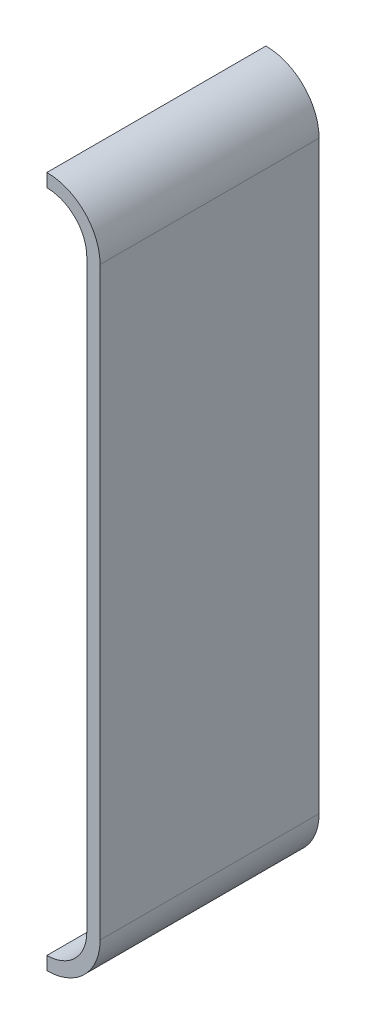
ISO-10303-21;
HEADER;
FILE_DESCRIPTION(('STEP AP214'),'2;1');
FILE_NAME('part.step','',(''),(''),'','','');
FILE_SCHEMA(('AUTOMOTIVE_DESIGN { 1 0 10303 214 1 1 1 1 }'));
ENDSEC;
DATA;
#1=APPLICATION_CONTEXT('core data for automotive mechanical design processes');
#2=APPLICATION_PROTOCOL_DEFINITION('international standard','automotive_design',2000,#1);
#3=PRODUCT_CONTEXT('',#1,'mechanical');
#4=PRODUCT('Part','Part','',(#3));
#5=PRODUCT_RELATED_PRODUCT_CATEGORY('part','',(#4));
#6=PRODUCT_DEFINITION_FORMATION('','',#4);
#7=PRODUCT_DEFINITION_CONTEXT('part definition',#1,'design');
#8=PRODUCT_DEFINITION('design','',#6,#7);
#9=PRODUCT_DEFINITION_SHAPE('','',#8);
#10=(LENGTH_UNIT() NAMED_UNIT(*) SI_UNIT(.MILLI.,.METRE.));
#11=(NAMED_UNIT(*) PLANE_ANGLE_UNIT() SI_UNIT($,.RADIAN.));
#12=(NAMED_UNIT(*) SI_UNIT($,.STERADIAN.) SOLID_ANGLE_UNIT());
#13=UNCERTAINTY_MEASURE_WITH_UNIT(LENGTH_MEASURE(1.E-05),#10,'distance_accuracy_value','');
#14=(GEOMETRIC_REPRESENTATION_CONTEXT(3) GLOBAL_UNCERTAINTY_ASSIGNED_CONTEXT((#13)) GLOBAL_UNIT_ASSIGNED_CONTEXT((#10,
#11,#12)) REPRESENTATION_CONTEXT('',''));
#15=CARTESIAN_POINT('',(0.,0.,0.));
#16=DIRECTION('',(0.,0.,1.));
#17=DIRECTION('',(1.,0.,0.));
#18=AXIS2_PLACEMENT_3D('',#15,#16,#17);
#19=CARTESIAN_POINT('',(3.175,0.,0.));
#20=DIRECTION('',(0.,0.,-1.));
#21=DIRECTION('',(-1.,0.,0.));
#22=AXIS2_PLACEMENT_3D('',#19,#20,#21);
#23=PLANE('',#22);
#24=DIRECTION('',(0.,-1.,0.));
#25=VECTOR('',#24,1.);
#26=CARTESIAN_POINT('',(0.,0.,0.));
#27=LINE('',#26,#25);
#28=CARTESIAN_POINT('',(0.,139.7,0.));
#29=VERTEX_POINT('',#28);
#30=CARTESIAN_POINT('',(0.,0.,0.));
#31=VERTEX_POINT('',#30);
#32=EDGE_CURVE('E122',#29,#31,#27,.T.);
#33=ORIENTED_EDGE('',*,*,#32,.T.);
#34=CARTESIAN_POINT('',(-9.52500000000001,0.,0.));
#35=DIRECTION('',(0.,0.,-1.));
#36=DIRECTION('',(-1.,0.,0.));
#37=AXIS2_PLACEMENT_3D('',#34,#35,#36);
#38=CIRCLE('',#37,9.52500000000001);
#39=CARTESIAN_POINT('',(-9.52500000000001,-9.52500000000001,0.));
#40=VERTEX_POINT('',#39);
#41=EDGE_CURVE('E126',#31,#40,#38,.T.);
#42=ORIENTED_EDGE('',*,*,#41,.T.);
#43=DIRECTION('',(0.,-1.,0.));
#44=VECTOR('',#43,1.);
#45=CARTESIAN_POINT('',(-9.52500000000001,-9.52500000000001,0.));
#46=LINE('',#45,#44);
#47=CARTESIAN_POINT('',(-9.52500000000001,-12.7,0.));
#48=VERTEX_POINT('',#47);
#49=EDGE_CURVE('E75',#40,#48,#46,.T.);
#50=ORIENTED_EDGE('',*,*,#49,.T.);
#51=CARTESIAN_POINT('',(-9.52500000000001,0.,0.));
#52=DIRECTION('',(0.,0.,-1.));
#53=DIRECTION('',(-1.,0.,0.));
#54=AXIS2_PLACEMENT_3D('',#51,#52,#53);
#55=CIRCLE('',#54,12.7);
#56=CARTESIAN_POINT('',(3.175,0.,0.));
#57=VERTEX_POINT('',#56);
#58=EDGE_CURVE('E119',#48,#57,#55,.F.);
#59=ORIENTED_EDGE('',*,*,#58,.T.);
#60=DIRECTION('',(0.,-1.,0.));
#61=VECTOR('',#60,1.);
#62=CARTESIAN_POINT('',(3.175,0.,0.));
#63=LINE('',#62,#61);
#64=CARTESIAN_POINT('',(3.175,139.7,0.));
#65=VERTEX_POINT('',#64);
#66=EDGE_CURVE('E87',#65,#57,#63,.T.);
#67=ORIENTED_EDGE('',*,*,#66,.F.);
#68=CARTESIAN_POINT('',(-9.52500000000001,139.7,0.));
#69=DIRECTION('',(0.,0.,-1.));
#70=DIRECTION('',(-1.,0.,0.));
#71=AXIS2_PLACEMENT_3D('',#68,#69,#70);
#72=CIRCLE('',#71,12.7);
#73=CARTESIAN_POINT('',(-9.52500000000001,152.4,0.));
#74=VERTEX_POINT('',#73);
#75=EDGE_CURVE('E168',#65,#74,#72,.F.);
#76=ORIENTED_EDGE('',*,*,#75,.T.);
#77=DIRECTION('',(0.,-1.,0.));
#78=VECTOR('',#77,1.);
#79=CARTESIAN_POINT('',(-9.52500000000001,149.225,0.));
#80=LINE('',#79,#78);
#81=CARTESIAN_POINT('',(-9.52500000000001,149.225,0.));
#82=VERTEX_POINT('',#81);
#83=EDGE_CURVE('E112',#74,#82,#80,.T.);
#84=ORIENTED_EDGE('',*,*,#83,.T.);
#85=CARTESIAN_POINT('',(-9.52500000000001,139.7,0.));
#86=DIRECTION('',(0.,0.,-1.));
#87=DIRECTION('',(-1.,0.,0.));
#88=AXIS2_PLACEMENT_3D('',#85,#86,#87);
#89=CIRCLE('',#88,9.52500000000001);
#90=EDGE_CURVE('E137',#82,#29,#89,.T.);
#91=ORIENTED_EDGE('',*,*,#90,.T.);
#92=EDGE_LOOP('',(#33,#42,#50,#59,#67,#76,#84,#91));
#93=FACE_BOUND('',#92,.T.);
#94=ADVANCED_FACE('F36',(#93),#23,.F.);
#95=CARTESIAN_POINT('',(3.175,0.,-52.300000048));
#96=DIRECTION('',(0.,0.,1.));
#97=DIRECTION('',(1.,0.,0.));
#98=AXIS2_PLACEMENT_3D('',#95,#96,#97);
#99=PLANE('',#98);
#100=DIRECTION('',(0.,1.,0.));
#101=VECTOR('',#100,1.);
#102=CARTESIAN_POINT('',(0.,0.,-52.300000048));
#103=LINE('',#102,#101);
#104=CARTESIAN_POINT('',(0.,0.,-52.300000048));
#105=VERTEX_POINT('',#104);
#106=CARTESIAN_POINT('',(0.,139.7,-52.300000048));
#107=VERTEX_POINT('',#106);
#108=EDGE_CURVE('E64',#105,#107,#103,.T.);
#109=ORIENTED_EDGE('',*,*,#108,.T.);
#110=CARTESIAN_POINT('',(-9.52500000000001,139.7,-52.300000048));
#111=DIRECTION('',(0.,0.,1.));
#112=DIRECTION('',(1.,0.,0.));
#113=AXIS2_PLACEMENT_3D('',#110,#111,#112);
#114=CIRCLE('',#113,9.52500000000001);
#115=CARTESIAN_POINT('',(-9.52500000000001,149.225,-52.300000048));
#116=VERTEX_POINT('',#115);
#117=EDGE_CURVE('E139',#107,#116,#114,.T.);
#118=ORIENTED_EDGE('',*,*,#117,.T.);
#119=DIRECTION('',(0.,1.,0.));
#120=VECTOR('',#119,1.);
#121=CARTESIAN_POINT('',(-9.52500000000001,149.225,-52.300000048));
#122=LINE('',#121,#120);
#123=CARTESIAN_POINT('',(-9.52500000000001,152.4,-52.300000048));
#124=VERTEX_POINT('',#123);
#125=EDGE_CURVE('E170',#116,#124,#122,.T.);
#126=ORIENTED_EDGE('',*,*,#125,.T.);
#127=CARTESIAN_POINT('',(-9.52500000000001,139.7,-52.300000048));
#128=DIRECTION('',(0.,0.,-1.));
#129=DIRECTION('',(1.,0.,0.));
#130=AXIS2_PLACEMENT_3D('',#127,#128,#129);
#131=CIRCLE('',#130,12.7);
#132=CARTESIAN_POINT('',(3.175,139.7,-52.300000048));
#133=VERTEX_POINT('',#132);
#134=EDGE_CURVE('E101',#124,#133,#131,.T.);
#135=ORIENTED_EDGE('',*,*,#134,.T.);
#136=DIRECTION('',(0.,1.,0.));
#137=VECTOR('',#136,1.);
#138=CARTESIAN_POINT('',(3.175,0.,-52.300000048));
#139=LINE('',#138,#137);
#140=CARTESIAN_POINT('',(3.175,0.,-52.300000048));
#141=VERTEX_POINT('',#140);
#142=EDGE_CURVE('E45',#141,#133,#139,.T.);
#143=ORIENTED_EDGE('',*,*,#142,.F.);
#144=CARTESIAN_POINT('',(-9.52500000000001,0.,-52.300000048));
#145=DIRECTION('',(0.,0.,-1.));
#146=DIRECTION('',(-1.,0.,0.));
#147=AXIS2_PLACEMENT_3D('',#144,#145,#146);
#148=CIRCLE('',#147,12.7);
#149=CARTESIAN_POINT('',(-9.52500000000001,-12.7,-52.300000048));
#150=VERTEX_POINT('',#149);
#151=EDGE_CURVE('E97',#141,#150,#148,.T.);
#152=ORIENTED_EDGE('',*,*,#151,.T.);
#153=DIRECTION('',(0.,1.,0.));
#154=VECTOR('',#153,1.);
#155=CARTESIAN_POINT('',(-9.52500000000001,-9.52500000000001,-52.300000048));
#156=LINE('',#155,#154);
#157=CARTESIAN_POINT('',(-9.52500000000001,-9.52500000000001,-52.300000048));
#158=VERTEX_POINT('',#157);
#159=EDGE_CURVE('E107',#150,#158,#156,.T.);
#160=ORIENTED_EDGE('',*,*,#159,.T.);
#161=CARTESIAN_POINT('',(-9.52500000000001,0.,-52.300000048));
#162=DIRECTION('',(0.,0.,1.));
#163=DIRECTION('',(-1.,0.,0.));
#164=AXIS2_PLACEMENT_3D('',#161,#162,#163);
#165=CIRCLE('',#164,9.52500000000001);
#166=EDGE_CURVE('E108',#158,#105,#165,.T.);
#167=ORIENTED_EDGE('',*,*,#166,.T.);
#168=EDGE_LOOP('',(#109,#118,#126,#135,#143,#152,#160,#167));
#169=FACE_BOUND('',#168,.T.);
#170=ADVANCED_FACE('F94',(#169),#99,.F.);
#171=CARTESIAN_POINT('',(3.175,0.,0.));
#172=DIRECTION('',(-1.,0.,0.));
#173=DIRECTION('',(0.,0.,1.));
#174=AXIS2_PLACEMENT_3D('',#171,#172,#173);
#175=PLANE('',#174);
#176=ORIENTED_EDGE('',*,*,#66,.T.);
#177=DIRECTION('',(0.,0.,-1.));
#178=VECTOR('',#177,1.);
#179=CARTESIAN_POINT('',(3.175,0.,0.));
#180=LINE('',#179,#178);
#181=EDGE_CURVE('E84',#57,#141,#180,.T.);
#182=ORIENTED_EDGE('',*,*,#181,.T.);
#183=ORIENTED_EDGE('',*,*,#142,.T.);
#184=DIRECTION('',(0.,0.,1.));
#185=VECTOR('',#184,1.);
#186=CARTESIAN_POINT('',(3.175,139.7,0.));
#187=LINE('',#186,#185);
#188=EDGE_CURVE('E11',#133,#65,#187,.T.);
#189=ORIENTED_EDGE('',*,*,#188,.T.);
#190=EDGE_LOOP('',(#176,#182,#183,#189));
#191=FACE_BOUND('',#190,.T.);
#192=ADVANCED_FACE('F86',(#191),#175,.F.);
#193=CARTESIAN_POINT('',(0.,0.,0.));
#194=DIRECTION('',(-1.,0.,0.));
#195=DIRECTION('',(0.,0.,1.));
#196=AXIS2_PLACEMENT_3D('',#193,#194,#195);
#197=PLANE('',#196);
#198=ORIENTED_EDGE('',*,*,#32,.F.);
#199=DIRECTION('',(0.,0.,1.));
#200=VECTOR('',#199,1.);
#201=CARTESIAN_POINT('',(0.,139.7,0.));
#202=LINE('',#201,#200);
#203=EDGE_CURVE('E39',#107,#29,#202,.T.);
#204=ORIENTED_EDGE('',*,*,#203,.F.);
#205=ORIENTED_EDGE('',*,*,#108,.F.);
#206=DIRECTION('',(0.,0.,-1.));
#207=VECTOR('',#206,1.);
#208=CARTESIAN_POINT('',(0.,0.,0.));
#209=LINE('',#208,#207);
#210=EDGE_CURVE('E125',#31,#105,#209,.T.);
#211=ORIENTED_EDGE('',*,*,#210,.F.);
#212=EDGE_LOOP('',(#198,#204,#205,#211));
#213=FACE_BOUND('',#212,.T.);
#214=ADVANCED_FACE('F140',(#213),#197,.T.);
#215=CARTESIAN_POINT('',(-9.52500000000001,0.,17.9605122421383));
#216=DIRECTION('',(0.,0.,-1.));
#217=DIRECTION('',(-1.,0.,0.));
#218=AXIS2_PLACEMENT_3D('',#215,#216,#217);
#219=CYLINDRICAL_SURFACE('',#218,9.52500000000001);
#220=ORIENTED_EDGE('',*,*,#41,.F.);
#221=ORIENTED_EDGE('',*,*,#210,.T.);
#222=ORIENTED_EDGE('',*,*,#166,.F.);
#223=DIRECTION('',(0.,0.,-1.));
#224=VECTOR('',#223,1.);
#225=CARTESIAN_POINT('',(-9.52500000000001,-9.52500000000001,17.9605122421383));
#226=LINE('',#225,#224);
#227=EDGE_CURVE('E116',#40,#158,#226,.T.);
#228=ORIENTED_EDGE('',*,*,#227,.F.);
#229=EDGE_LOOP('',(#220,#221,#222,#228));
#230=FACE_BOUND('',#229,.T.);
#231=ADVANCED_FACE('F159',(#230),#219,.F.);
#232=CARTESIAN_POINT('',(-9.52500000000001,-9.52500000000001,17.9605122421383));
#233=DIRECTION('',(-1.,0.,0.));
#234=DIRECTION('',(0.,0.,1.));
#235=AXIS2_PLACEMENT_3D('',#232,#233,#234);
#236=PLANE('',#235);
#237=ORIENTED_EDGE('',*,*,#49,.F.);
#238=ORIENTED_EDGE('',*,*,#227,.T.);
#239=ORIENTED_EDGE('',*,*,#159,.F.);
#240=DIRECTION('',(0.,0.,-1.));
#241=VECTOR('',#240,1.);
#242=CARTESIAN_POINT('',(-9.52500000000001,-12.7,17.9605122421383));
#243=LINE('',#242,#241);
#244=EDGE_CURVE('E106',#48,#150,#243,.T.);
#245=ORIENTED_EDGE('',*,*,#244,.F.);
#246=EDGE_LOOP('',(#237,#238,#239,#245));
#247=FACE_BOUND('',#246,.T.);
#248=ADVANCED_FACE('F202',(#247),#236,.T.);
#249=CARTESIAN_POINT('',(-9.52500000000001,0.,17.9605122421383));
#250=DIRECTION('',(0.,0.,-1.));
#251=DIRECTION('',(-1.,0.,0.));
#252=AXIS2_PLACEMENT_3D('',#249,#250,#251);
#253=CYLINDRICAL_SURFACE('',#252,12.7);
#254=ORIENTED_EDGE('',*,*,#58,.F.);
#255=ORIENTED_EDGE('',*,*,#244,.T.);
#256=ORIENTED_EDGE('',*,*,#151,.F.);
#257=ORIENTED_EDGE('',*,*,#181,.F.);
#258=EDGE_LOOP('',(#254,#255,#256,#257));
#259=FACE_BOUND('',#258,.T.);
#260=ADVANCED_FACE('F104',(#259),#253,.T.);
#261=CARTESIAN_POINT('',(-9.52500000000001,139.7,17.9605122421383));
#262=DIRECTION('',(0.,0.,-1.));
#263=DIRECTION('',(-1.,0.,0.));
#264=AXIS2_PLACEMENT_3D('',#261,#262,#263);
#265=CYLINDRICAL_SURFACE('',#264,9.52500000000001);
#266=ORIENTED_EDGE('',*,*,#90,.F.);
#267=DIRECTION('',(0.,0.,-1.));
#268=VECTOR('',#267,1.);
#269=CARTESIAN_POINT('',(-9.52500000000001,149.225,17.9605122421383));
#270=LINE('',#269,#268);
#271=EDGE_CURVE('E164',#82,#116,#270,.T.);
#272=ORIENTED_EDGE('',*,*,#271,.T.);
#273=ORIENTED_EDGE('',*,*,#117,.F.);
#274=ORIENTED_EDGE('',*,*,#203,.T.);
#275=EDGE_LOOP('',(#266,#272,#273,#274));
#276=FACE_BOUND('',#275,.T.);
#277=ADVANCED_FACE('F133',(#276),#265,.F.);
#278=CARTESIAN_POINT('',(-9.52500000000001,139.7,17.9605122421383));
#279=DIRECTION('',(0.,0.,-1.));
#280=DIRECTION('',(-1.,0.,0.));
#281=AXIS2_PLACEMENT_3D('',#278,#279,#280);
#282=CYLINDRICAL_SURFACE('',#281,12.7);
#283=ORIENTED_EDGE('',*,*,#75,.F.);
#284=ORIENTED_EDGE('',*,*,#188,.F.);
#285=ORIENTED_EDGE('',*,*,#134,.F.);
#286=DIRECTION('',(0.,0.,-1.));
#287=VECTOR('',#286,1.);
#288=CARTESIAN_POINT('',(-9.52500000000001,152.4,17.9605122421383));
#289=LINE('',#288,#287);
#290=EDGE_CURVE('E166',#74,#124,#289,.T.);
#291=ORIENTED_EDGE('',*,*,#290,.F.);
#292=EDGE_LOOP('',(#283,#284,#285,#291));
#293=FACE_BOUND('',#292,.T.);
#294=ADVANCED_FACE('F178',(#293),#282,.T.);
#295=CARTESIAN_POINT('',(-9.52500000000001,149.225,17.9605122421383));
#296=DIRECTION('',(-1.,0.,0.));
#297=DIRECTION('',(0.,0.,1.));
#298=AXIS2_PLACEMENT_3D('',#295,#296,#297);
#299=PLANE('',#298);
#300=ORIENTED_EDGE('',*,*,#83,.F.);
#301=ORIENTED_EDGE('',*,*,#290,.T.);
#302=ORIENTED_EDGE('',*,*,#125,.F.);
#303=ORIENTED_EDGE('',*,*,#271,.F.);
#304=EDGE_LOOP('',(#300,#301,#302,#303));
#305=FACE_BOUND('',#304,.T.);
#306=ADVANCED_FACE('F181',(#305),#299,.T.);
#307=CLOSED_SHELL('',(#94,#170,#192,#214,#231,#248,#260,#277,#294,#306));
#308=MANIFOLD_SOLID_BREP('B2',#307);
#309=ADVANCED_BREP_SHAPE_REPRESENTATION('',(#18,#308),#14);
#310=SHAPE_DEFINITION_REPRESENTATION(#9,#309);
ENDSEC;
END-ISO-10303-21;
